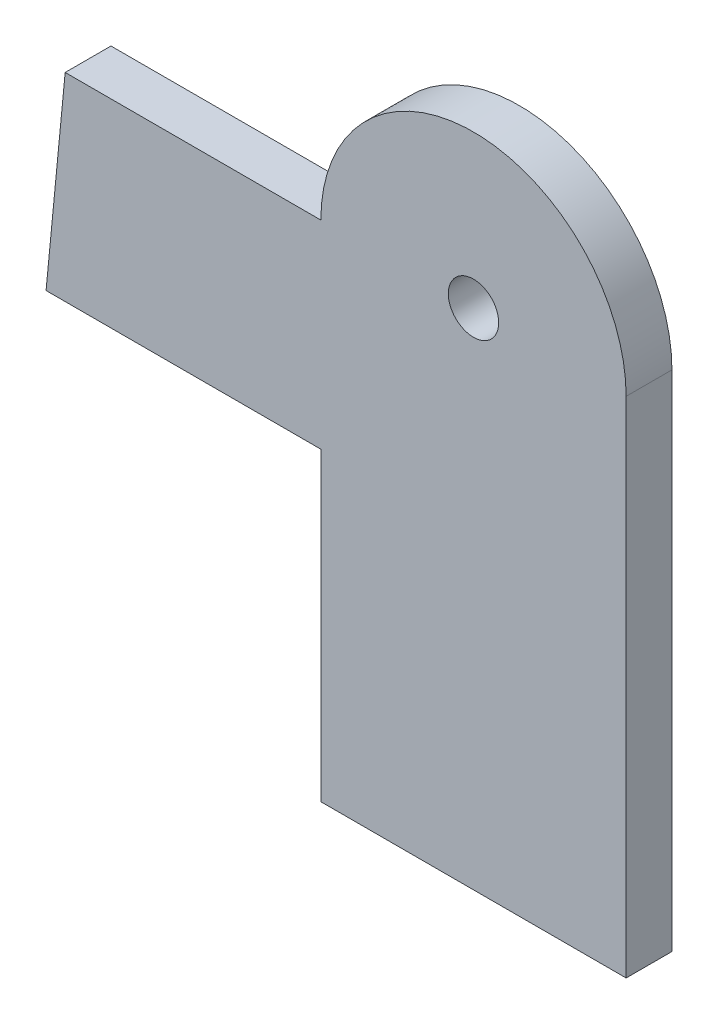
ISO-10303-21;
HEADER;
FILE_DESCRIPTION(('STEP AP214'),'2;1');
FILE_NAME('part.step','',(''),(''),'','','');
FILE_SCHEMA(('AUTOMOTIVE_DESIGN { 1 0 10303 214 1 1 1 1 }'));
ENDSEC;
DATA;
#1=APPLICATION_CONTEXT('core data for automotive mechanical design processes');
#2=APPLICATION_PROTOCOL_DEFINITION('international standard','automotive_design',2000,#1);
#3=PRODUCT_CONTEXT('',#1,'mechanical');
#4=PRODUCT('Part','Part','',(#3));
#5=PRODUCT_RELATED_PRODUCT_CATEGORY('part','',(#4));
#6=PRODUCT_DEFINITION_FORMATION('','',#4);
#7=PRODUCT_DEFINITION_CONTEXT('part definition',#1,'design');
#8=PRODUCT_DEFINITION('design','',#6,#7);
#9=PRODUCT_DEFINITION_SHAPE('','',#8);
#10=(LENGTH_UNIT() NAMED_UNIT(*) SI_UNIT(.MILLI.,.METRE.));
#11=(NAMED_UNIT(*) PLANE_ANGLE_UNIT() SI_UNIT($,.RADIAN.));
#12=(NAMED_UNIT(*) SI_UNIT($,.STERADIAN.) SOLID_ANGLE_UNIT());
#13=UNCERTAINTY_MEASURE_WITH_UNIT(LENGTH_MEASURE(1.E-05),#10,'distance_accuracy_value','');
#14=(GEOMETRIC_REPRESENTATION_CONTEXT(3) GLOBAL_UNCERTAINTY_ASSIGNED_CONTEXT((#13)) GLOBAL_UNIT_ASSIGNED_CONTEXT((#10,
#11,#12)) REPRESENTATION_CONTEXT('',''));
#15=CARTESIAN_POINT('',(0.,0.,0.));
#16=DIRECTION('',(0.,0.,1.));
#17=DIRECTION('',(1.,0.,0.));
#18=AXIS2_PLACEMENT_3D('',#15,#16,#17);
#19=CARTESIAN_POINT('',(10.,33.,3.));
#20=DIRECTION('',(0.,0.,1.));
#21=DIRECTION('',(1.,0.,0.));
#22=AXIS2_PLACEMENT_3D('',#19,#20,#21);
#23=PLANE('',#22);
#24=CARTESIAN_POINT('',(10.,33.,3.));
#25=DIRECTION('',(0.,0.,1.));
#26=DIRECTION('',(1.,0.,0.));
#27=AXIS2_PLACEMENT_3D('',#24,#25,#26);
#28=CIRCLE('',#27,10.);
#29=CARTESIAN_POINT('',(20.,33.,3.));
#30=VERTEX_POINT('',#29);
#31=CARTESIAN_POINT('',(0.,33.,3.));
#32=VERTEX_POINT('',#31);
#33=EDGE_CURVE('E144',#30,#32,#28,.T.);
#34=ORIENTED_EDGE('',*,*,#33,.T.);
#35=DIRECTION('',(1.,0.,0.));
#36=VECTOR('',#35,1.);
#37=CARTESIAN_POINT('',(-16.7482423734319,33.,3.));
#38=LINE('',#37,#36);
#39=CARTESIAN_POINT('',(-16.7482423734319,33.,3.));
#40=VERTEX_POINT('',#39);
#41=EDGE_CURVE('E104',#40,#32,#38,.T.);
#42=ORIENTED_EDGE('',*,*,#41,.F.);
#43=DIRECTION('',(0.0958457525202279,0.995396198367179,0.));
#44=VECTOR('',#43,1.);
#45=CARTESIAN_POINT('',(-18.,20.,3.));
#46=LINE('',#45,#44);
#47=CARTESIAN_POINT('',(-18.,20.,3.));
#48=VERTEX_POINT('',#47);
#49=EDGE_CURVE('E101',#48,#40,#46,.T.);
#50=ORIENTED_EDGE('',*,*,#49,.F.);
#51=DIRECTION('',(-1.,0.,0.));
#52=VECTOR('',#51,1.);
#53=CARTESIAN_POINT('',(0.,20.,3.));
#54=LINE('',#53,#52);
#55=CARTESIAN_POINT('',(0.,20.,3.));
#56=VERTEX_POINT('',#55);
#57=EDGE_CURVE('E121',#56,#48,#54,.T.);
#58=ORIENTED_EDGE('',*,*,#57,.F.);
#59=DIRECTION('',(0.,-1.,0.));
#60=VECTOR('',#59,1.);
#61=CARTESIAN_POINT('',(0.,33.,3.));
#62=LINE('',#61,#60);
#63=CARTESIAN_POINT('',(0.,0.,3.));
#64=VERTEX_POINT('',#63);
#65=EDGE_CURVE('E51',#56,#64,#62,.T.);
#66=ORIENTED_EDGE('',*,*,#65,.T.);
#67=DIRECTION('',(1.,0.,0.));
#68=VECTOR('',#67,1.);
#69=CARTESIAN_POINT('',(0.,0.,3.));
#70=LINE('',#69,#68);
#71=CARTESIAN_POINT('',(20.,0.,3.));
#72=VERTEX_POINT('',#71);
#73=EDGE_CURVE('E139',#64,#72,#70,.T.);
#74=ORIENTED_EDGE('',*,*,#73,.T.);
#75=DIRECTION('',(0.,1.,0.));
#76=VECTOR('',#75,1.);
#77=CARTESIAN_POINT('',(20.,0.,3.));
#78=LINE('',#77,#76);
#79=EDGE_CURVE('E142',#72,#30,#78,.T.);
#80=ORIENTED_EDGE('',*,*,#79,.T.);
#81=EDGE_LOOP('',(#34,#42,#50,#58,#66,#74,#80));
#82=FACE_BOUND('',#81,.T.);
#83=CARTESIAN_POINT('',(10.,33.,3.));
#84=DIRECTION('',(0.,0.,1.));
#85=DIRECTION('',(1.,0.,0.));
#86=AXIS2_PLACEMENT_3D('',#83,#84,#85);
#87=CIRCLE('',#86,1.65);
#88=CARTESIAN_POINT('',(11.65,33.,3.));
#89=VERTEX_POINT('',#88);
#90=EDGE_CURVE('E132',#89,#89,#87,.T.);
#91=ORIENTED_EDGE('',*,*,#90,.F.);
#92=EDGE_LOOP('',(#91));
#93=FACE_BOUND('',#92,.T.);
#94=ADVANCED_FACE('F36',(#82,#93),#23,.T.);
#95=CARTESIAN_POINT('',(10.,33.,0.));
#96=DIRECTION('',(0.,0.,1.));
#97=DIRECTION('',(1.,0.,0.));
#98=AXIS2_PLACEMENT_3D('',#95,#96,#97);
#99=PLANE('',#98);
#100=DIRECTION('',(0.,-1.,0.));
#101=VECTOR('',#100,1.);
#102=CARTESIAN_POINT('',(0.,33.,0.));
#103=LINE('',#102,#101);
#104=CARTESIAN_POINT('',(0.,20.,0.));
#105=VERTEX_POINT('',#104);
#106=CARTESIAN_POINT('',(0.,0.,0.));
#107=VERTEX_POINT('',#106);
#108=EDGE_CURVE('E135',#105,#107,#103,.T.);
#109=ORIENTED_EDGE('',*,*,#108,.F.);
#110=DIRECTION('',(-1.,0.,0.));
#111=VECTOR('',#110,1.);
#112=CARTESIAN_POINT('',(0.,20.,0.));
#113=LINE('',#112,#111);
#114=CARTESIAN_POINT('',(-18.,20.,0.));
#115=VERTEX_POINT('',#114);
#116=EDGE_CURVE('E114',#105,#115,#113,.T.);
#117=ORIENTED_EDGE('',*,*,#116,.T.);
#118=DIRECTION('',(0.0958457525202279,0.995396198367179,0.));
#119=VECTOR('',#118,1.);
#120=CARTESIAN_POINT('',(-18.,20.,0.));
#121=LINE('',#120,#119);
#122=CARTESIAN_POINT('',(-16.7482423734319,33.,0.));
#123=VERTEX_POINT('',#122);
#124=EDGE_CURVE('E100',#115,#123,#121,.T.);
#125=ORIENTED_EDGE('',*,*,#124,.T.);
#126=DIRECTION('',(1.,0.,0.));
#127=VECTOR('',#126,1.);
#128=CARTESIAN_POINT('',(-16.7482423734319,33.,0.));
#129=LINE('',#128,#127);
#130=CARTESIAN_POINT('',(0.,33.,0.));
#131=VERTEX_POINT('',#130);
#132=EDGE_CURVE('E108',#123,#131,#129,.T.);
#133=ORIENTED_EDGE('',*,*,#132,.T.);
#134=CARTESIAN_POINT('',(10.,33.,0.));
#135=DIRECTION('',(0.,0.,1.));
#136=DIRECTION('',(1.,0.,0.));
#137=AXIS2_PLACEMENT_3D('',#134,#135,#136);
#138=CIRCLE('',#137,10.);
#139=CARTESIAN_POINT('',(20.,33.,0.));
#140=VERTEX_POINT('',#139);
#141=EDGE_CURVE('E140',#140,#131,#138,.T.);
#142=ORIENTED_EDGE('',*,*,#141,.F.);
#143=DIRECTION('',(0.,1.,0.));
#144=VECTOR('',#143,1.);
#145=CARTESIAN_POINT('',(20.,0.,0.));
#146=LINE('',#145,#144);
#147=CARTESIAN_POINT('',(20.,0.,0.));
#148=VERTEX_POINT('',#147);
#149=EDGE_CURVE('E149',#148,#140,#146,.T.);
#150=ORIENTED_EDGE('',*,*,#149,.F.);
#151=DIRECTION('',(1.,0.,0.));
#152=VECTOR('',#151,1.);
#153=CARTESIAN_POINT('',(0.,0.,0.));
#154=LINE('',#153,#152);
#155=EDGE_CURVE('E147',#107,#148,#154,.T.);
#156=ORIENTED_EDGE('',*,*,#155,.F.);
#157=EDGE_LOOP('',(#109,#117,#125,#133,#142,#150,#156));
#158=FACE_BOUND('',#157,.T.);
#159=CARTESIAN_POINT('',(10.,33.,0.));
#160=DIRECTION('',(0.,0.,1.));
#161=DIRECTION('',(1.,0.,0.));
#162=AXIS2_PLACEMENT_3D('',#159,#160,#161);
#163=CIRCLE('',#162,1.65);
#164=CARTESIAN_POINT('',(11.65,33.,0.));
#165=VERTEX_POINT('',#164);
#166=EDGE_CURVE('E126',#165,#165,#163,.T.);
#167=ORIENTED_EDGE('',*,*,#166,.T.);
#168=EDGE_LOOP('',(#167));
#169=FACE_BOUND('',#168,.T.);
#170=ADVANCED_FACE('F117',(#158,#169),#99,.F.);
#171=CARTESIAN_POINT('',(0.,33.,3.));
#172=DIRECTION('',(1.,0.,0.));
#173=DIRECTION('',(0.,1.,0.));
#174=AXIS2_PLACEMENT_3D('',#171,#172,#173);
#175=PLANE('',#174);
#176=ORIENTED_EDGE('',*,*,#65,.F.);
#177=DIRECTION('',(0.,0.,-1.));
#178=VECTOR('',#177,1.);
#179=CARTESIAN_POINT('',(0.,20.,25.2036033111745));
#180=LINE('',#179,#178);
#181=EDGE_CURVE('E56',#56,#105,#180,.T.);
#182=ORIENTED_EDGE('',*,*,#181,.T.);
#183=ORIENTED_EDGE('',*,*,#108,.T.);
#184=DIRECTION('',(0.,0.,-1.));
#185=VECTOR('',#184,1.);
#186=CARTESIAN_POINT('',(0.,0.,3.));
#187=LINE('',#186,#185);
#188=EDGE_CURVE('E11',#64,#107,#187,.T.);
#189=ORIENTED_EDGE('',*,*,#188,.F.);
#190=EDGE_LOOP('',(#176,#182,#183,#189));
#191=FACE_BOUND('',#190,.T.);
#192=ADVANCED_FACE('F38',(#191),#175,.F.);
#193=CARTESIAN_POINT('',(0.,0.,3.));
#194=DIRECTION('',(0.,1.,0.));
#195=DIRECTION('',(0.,0.,1.));
#196=AXIS2_PLACEMENT_3D('',#193,#194,#195);
#197=PLANE('',#196);
#198=ORIENTED_EDGE('',*,*,#155,.T.);
#199=DIRECTION('',(0.,0.,-1.));
#200=VECTOR('',#199,1.);
#201=CARTESIAN_POINT('',(20.,0.,3.));
#202=LINE('',#201,#200);
#203=EDGE_CURVE('E44',#72,#148,#202,.T.);
#204=ORIENTED_EDGE('',*,*,#203,.F.);
#205=ORIENTED_EDGE('',*,*,#73,.F.);
#206=ORIENTED_EDGE('',*,*,#188,.T.);
#207=EDGE_LOOP('',(#198,#204,#205,#206));
#208=FACE_BOUND('',#207,.T.);
#209=ADVANCED_FACE('F170',(#208),#197,.F.);
#210=CARTESIAN_POINT('',(20.,0.,3.));
#211=DIRECTION('',(-1.,0.,0.));
#212=DIRECTION('',(0.,0.,1.));
#213=AXIS2_PLACEMENT_3D('',#210,#211,#212);
#214=PLANE('',#213);
#215=ORIENTED_EDGE('',*,*,#149,.T.);
#216=DIRECTION('',(0.,0.,-1.));
#217=VECTOR('',#216,1.);
#218=CARTESIAN_POINT('',(20.,33.,3.));
#219=LINE('',#218,#217);
#220=EDGE_CURVE('E153',#30,#140,#219,.T.);
#221=ORIENTED_EDGE('',*,*,#220,.F.);
#222=ORIENTED_EDGE('',*,*,#79,.F.);
#223=ORIENTED_EDGE('',*,*,#203,.T.);
#224=EDGE_LOOP('',(#215,#221,#222,#223));
#225=FACE_BOUND('',#224,.T.);
#226=ADVANCED_FACE('F160',(#225),#214,.F.);
#227=CARTESIAN_POINT('',(10.,33.,3.));
#228=DIRECTION('',(0.,0.,-1.));
#229=DIRECTION('',(-1.,0.,0.));
#230=AXIS2_PLACEMENT_3D('',#227,#228,#229);
#231=CYLINDRICAL_SURFACE('',#230,10.);
#232=ORIENTED_EDGE('',*,*,#141,.T.);
#233=DIRECTION('',(0.,0.,-1.));
#234=VECTOR('',#233,1.);
#235=CARTESIAN_POINT('',(0.,33.,3.));
#236=LINE('',#235,#234);
#237=EDGE_CURVE('E111',#32,#131,#236,.T.);
#238=ORIENTED_EDGE('',*,*,#237,.F.);
#239=ORIENTED_EDGE('',*,*,#33,.F.);
#240=ORIENTED_EDGE('',*,*,#220,.T.);
#241=EDGE_LOOP('',(#232,#238,#239,#240));
#242=FACE_BOUND('',#241,.T.);
#243=ADVANCED_FACE('F166',(#242),#231,.T.);
#244=CARTESIAN_POINT('',(10.,33.,3.));
#245=DIRECTION('',(0.,0.,-1.));
#246=DIRECTION('',(-1.,0.,0.));
#247=AXIS2_PLACEMENT_3D('',#244,#245,#246);
#248=CYLINDRICAL_SURFACE('',#247,1.65);
#249=ORIENTED_EDGE('',*,*,#90,.T.);
#250=EDGE_LOOP('',(#249));
#251=FACE_BOUND('',#250,.T.);
#252=ORIENTED_EDGE('',*,*,#166,.F.);
#253=EDGE_LOOP('',(#252));
#254=FACE_BOUND('',#253,.T.);
#255=ADVANCED_FACE('F174',(#251,#254),#248,.F.);
#256=CARTESIAN_POINT('',(0.,20.,25.2036033111745));
#257=DIRECTION('',(0.,-1.,0.));
#258=DIRECTION('',(0.,0.,-1.));
#259=AXIS2_PLACEMENT_3D('',#256,#257,#258);
#260=PLANE('',#259);
#261=ORIENTED_EDGE('',*,*,#181,.F.);
#262=ORIENTED_EDGE('',*,*,#57,.T.);
#263=DIRECTION('',(0.,0.,-1.));
#264=VECTOR('',#263,1.);
#265=CARTESIAN_POINT('',(-18.,20.,25.2036033111745));
#266=LINE('',#265,#264);
#267=EDGE_CURVE('E128',#48,#115,#266,.T.);
#268=ORIENTED_EDGE('',*,*,#267,.T.);
#269=ORIENTED_EDGE('',*,*,#116,.F.);
#270=EDGE_LOOP('',(#261,#262,#268,#269));
#271=FACE_BOUND('',#270,.T.);
#272=ADVANCED_FACE('F172',(#271),#260,.T.);
#273=CARTESIAN_POINT('',(-18.,20.,25.2036033111745));
#274=DIRECTION('',(-0.995396198367178,0.0958457525202279,0.));
#275=DIRECTION('',(-0.0958457525202279,-0.995396198367179,0.));
#276=AXIS2_PLACEMENT_3D('',#273,#274,#275);
#277=PLANE('',#276);
#278=ORIENTED_EDGE('',*,*,#267,.F.);
#279=ORIENTED_EDGE('',*,*,#49,.T.);
#280=DIRECTION('',(0.,0.,-1.));
#281=VECTOR('',#280,1.);
#282=CARTESIAN_POINT('',(-16.7482423734319,33.,25.2036033111745));
#283=LINE('',#282,#281);
#284=EDGE_CURVE('E95',#40,#123,#283,.T.);
#285=ORIENTED_EDGE('',*,*,#284,.T.);
#286=ORIENTED_EDGE('',*,*,#124,.F.);
#287=EDGE_LOOP('',(#278,#279,#285,#286));
#288=FACE_BOUND('',#287,.T.);
#289=ADVANCED_FACE('F98',(#288),#277,.T.);
#290=CARTESIAN_POINT('',(-16.7482423734319,33.,25.2036033111745));
#291=DIRECTION('',(0.,1.,0.));
#292=DIRECTION('',(0.,0.,1.));
#293=AXIS2_PLACEMENT_3D('',#290,#291,#292);
#294=PLANE('',#293);
#295=ORIENTED_EDGE('',*,*,#284,.F.);
#296=ORIENTED_EDGE('',*,*,#41,.T.);
#297=ORIENTED_EDGE('',*,*,#237,.T.);
#298=ORIENTED_EDGE('',*,*,#132,.F.);
#299=EDGE_LOOP('',(#295,#296,#297,#298));
#300=FACE_BOUND('',#299,.T.);
#301=ADVANCED_FACE('F109',(#300),#294,.T.);
#302=CLOSED_SHELL('',(#94,#170,#192,#209,#226,#243,#255,#272,#289,#301));
#303=MANIFOLD_SOLID_BREP('B2',#302);
#304=ADVANCED_BREP_SHAPE_REPRESENTATION('',(#18,#303),#14);
#305=SHAPE_DEFINITION_REPRESENTATION(#9,#304);
ENDSEC;
END-ISO-10303-21;
